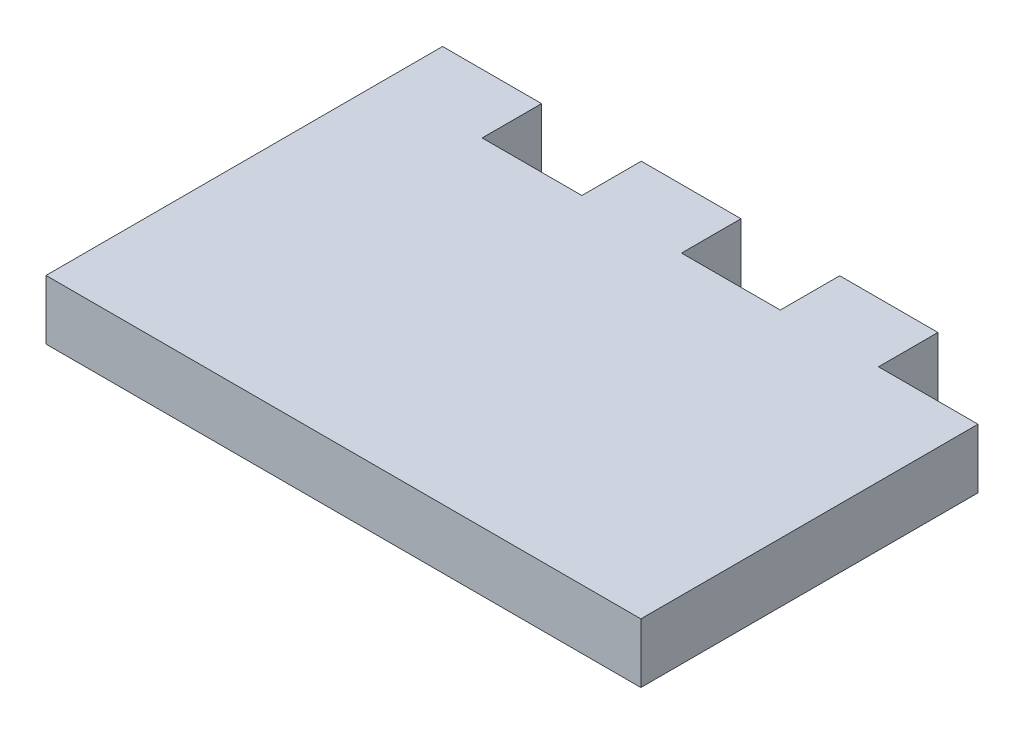
ISO-10303-21;
HEADER;
FILE_DESCRIPTION(('STEP AP214'),'2;1');
FILE_NAME('part.step','',(''),(''),'','','');
FILE_SCHEMA(('AUTOMOTIVE_DESIGN { 1 0 10303 214 1 1 1 1 }'));
ENDSEC;
DATA;
#1=APPLICATION_CONTEXT('core data for automotive mechanical design processes');
#2=APPLICATION_PROTOCOL_DEFINITION('international standard','automotive_design',2000,#1);
#3=PRODUCT_CONTEXT('',#1,'mechanical');
#4=PRODUCT('Part','Part','',(#3));
#5=PRODUCT_RELATED_PRODUCT_CATEGORY('part','',(#4));
#6=PRODUCT_DEFINITION_FORMATION('','',#4);
#7=PRODUCT_DEFINITION_CONTEXT('part definition',#1,'design');
#8=PRODUCT_DEFINITION('design','',#6,#7);
#9=PRODUCT_DEFINITION_SHAPE('','',#8);
#10=(LENGTH_UNIT() NAMED_UNIT(*) SI_UNIT(.MILLI.,.METRE.));
#11=(NAMED_UNIT(*) PLANE_ANGLE_UNIT() SI_UNIT($,.RADIAN.));
#12=(NAMED_UNIT(*) SI_UNIT($,.STERADIAN.) SOLID_ANGLE_UNIT());
#13=UNCERTAINTY_MEASURE_WITH_UNIT(LENGTH_MEASURE(1.E-05),#10,'distance_accuracy_value','');
#14=(GEOMETRIC_REPRESENTATION_CONTEXT(3) GLOBAL_UNCERTAINTY_ASSIGNED_CONTEXT((#13)) GLOBAL_UNIT_ASSIGNED_CONTEXT((#10,
#11,#12)) REPRESENTATION_CONTEXT('',''));
#15=CARTESIAN_POINT('',(0.,0.,0.));
#16=DIRECTION('',(0.,0.,1.));
#17=DIRECTION('',(1.,0.,0.));
#18=AXIS2_PLACEMENT_3D('',#15,#16,#17);
#19=CARTESIAN_POINT('',(0.,3.,-20.));
#20=DIRECTION('',(0.,0.,-1.));
#21=DIRECTION('',(-1.,0.,0.));
#22=AXIS2_PLACEMENT_3D('',#19,#20,#21);
#23=PLANE('',#22);
#24=DIRECTION('',(1.,0.,0.));
#25=VECTOR('',#24,1.);
#26=CARTESIAN_POINT('',(0.,0.,-20.));
#27=LINE('',#26,#25);
#28=CARTESIAN_POINT('',(10.021053013692,0.,-20.));
#29=VERTEX_POINT('',#28);
#30=CARTESIAN_POINT('',(15.0490536648897,0.,-20.));
#31=VERTEX_POINT('',#30);
#32=EDGE_CURVE('E198',#29,#31,#27,.T.);
#33=ORIENTED_EDGE('',*,*,#32,.F.);
#34=DIRECTION('',(0.,1.,0.));
#35=VECTOR('',#34,1.);
#36=CARTESIAN_POINT('',(10.021053013692,0.,-20.));
#37=LINE('',#36,#35);
#38=CARTESIAN_POINT('',(10.021053013692,3.,-20.));
#39=VERTEX_POINT('',#38);
#40=EDGE_CURVE('E190',#29,#39,#37,.T.);
#41=ORIENTED_EDGE('',*,*,#40,.T.);
#42=DIRECTION('',(1.,0.,0.));
#43=VECTOR('',#42,1.);
#44=CARTESIAN_POINT('',(0.,3.,-20.));
#45=LINE('',#44,#43);
#46=CARTESIAN_POINT('',(15.0490536648897,3.,-20.));
#47=VERTEX_POINT('',#46);
#48=EDGE_CURVE('E287',#39,#47,#45,.T.);
#49=ORIENTED_EDGE('',*,*,#48,.T.);
#50=DIRECTION('',(0.,1.,0.));
#51=VECTOR('',#50,1.);
#52=CARTESIAN_POINT('',(15.0490536648897,0.,-20.));
#53=LINE('',#52,#51);
#54=EDGE_CURVE('E232',#31,#47,#53,.T.);
#55=ORIENTED_EDGE('',*,*,#54,.F.);
#56=EDGE_LOOP('',(#33,#41,#49,#55));
#57=FACE_BOUND('',#56,.T.);
#58=ADVANCED_FACE('F63',(#57),#23,.T.);
#59=CARTESIAN_POINT('',(20.0280006511977,0.,-20.));
#60=VERTEX_POINT('',#59);
#61=CARTESIAN_POINT('',(24.9824208050608,0.,-20.));
#62=VERTEX_POINT('',#61);
#63=EDGE_CURVE('E200',#60,#62,#27,.T.);
#64=ORIENTED_EDGE('',*,*,#63,.F.);
#65=DIRECTION('',(0.,1.,0.));
#66=VECTOR('',#65,1.);
#67=CARTESIAN_POINT('',(20.0280006511977,0.,-20.));
#68=LINE('',#67,#66);
#69=CARTESIAN_POINT('',(20.0280006511977,3.,-20.));
#70=VERTEX_POINT('',#69);
#71=EDGE_CURVE('E228',#60,#70,#68,.T.);
#72=ORIENTED_EDGE('',*,*,#71,.T.);
#73=CARTESIAN_POINT('',(24.9824208050608,3.,-20.));
#74=VERTEX_POINT('',#73);
#75=EDGE_CURVE('E288',#70,#74,#45,.T.);
#76=ORIENTED_EDGE('',*,*,#75,.T.);
#77=DIRECTION('',(0.,1.,0.));
#78=VECTOR('',#77,1.);
#79=CARTESIAN_POINT('',(24.9824208050608,0.,-20.));
#80=LINE('',#79,#78);
#81=EDGE_CURVE('E270',#62,#74,#80,.T.);
#82=ORIENTED_EDGE('',*,*,#81,.F.);
#83=EDGE_LOOP('',(#64,#72,#76,#82));
#84=FACE_BOUND('',#83,.T.);
#85=ADVANCED_FACE('F347',(#84),#23,.T.);
#86=CARTESIAN_POINT('',(0.,3.,0.));
#87=DIRECTION('',(0.,1.,0.));
#88=DIRECTION('',(0.,0.,1.));
#89=AXIS2_PLACEMENT_3D('',#86,#87,#88);
#90=PLANE('',#89);
#91=DIRECTION('',(0.,0.,1.));
#92=VECTOR('',#91,1.);
#93=CARTESIAN_POINT('',(4.99305236249431,3.,0.));
#94=LINE('',#93,#92);
#95=CARTESIAN_POINT('',(4.99305236249431,3.,-20.));
#96=VERTEX_POINT('',#95);
#97=CARTESIAN_POINT('',(4.99305236249431,3.,-17.0024106630095));
#98=VERTEX_POINT('',#97);
#99=EDGE_CURVE('E317',#96,#98,#94,.T.);
#100=ORIENTED_EDGE('',*,*,#99,.F.);
#101=CARTESIAN_POINT('',(0.,3.,-20.));
#102=VERTEX_POINT('',#101);
#103=EDGE_CURVE('E188',#102,#96,#45,.T.);
#104=ORIENTED_EDGE('',*,*,#103,.F.);
#105=DIRECTION('',(0.,0.,-1.));
#106=VECTOR('',#105,1.);
#107=CARTESIAN_POINT('',(0.,3.,0.));
#108=LINE('',#107,#106);
#109=CARTESIAN_POINT('',(0.,3.,0.));
#110=VERTEX_POINT('',#109);
#111=EDGE_CURVE('E294',#110,#102,#108,.T.);
#112=ORIENTED_EDGE('',*,*,#111,.F.);
#113=DIRECTION('',(1.,0.,0.));
#114=VECTOR('',#113,1.);
#115=CARTESIAN_POINT('',(0.,3.,0.));
#116=LINE('',#115,#114);
#117=CARTESIAN_POINT('',(30.,3.,0.));
#118=VERTEX_POINT('',#117);
#119=EDGE_CURVE('E292',#110,#118,#116,.T.);
#120=ORIENTED_EDGE('',*,*,#119,.T.);
#121=DIRECTION('',(0.,0.,-1.));
#122=VECTOR('',#121,1.);
#123=CARTESIAN_POINT('',(30.,3.,0.));
#124=LINE('',#123,#122);
#125=CARTESIAN_POINT('',(30.,3.,-17.0024106630095));
#126=VERTEX_POINT('',#125);
#127=EDGE_CURVE('E286',#118,#126,#124,.T.);
#128=ORIENTED_EDGE('',*,*,#127,.T.);
#129=DIRECTION('',(1.,0.,0.));
#130=VECTOR('',#129,1.);
#131=CARTESIAN_POINT('',(0.,3.,-17.0024106630095));
#132=LINE('',#131,#130);
#133=CARTESIAN_POINT('',(24.9824208050608,3.,-17.0024106630095));
#134=VERTEX_POINT('',#133);
#135=EDGE_CURVE('E273',#134,#126,#132,.T.);
#136=ORIENTED_EDGE('',*,*,#135,.F.);
#137=DIRECTION('',(0.,0.,1.));
#138=VECTOR('',#137,1.);
#139=CARTESIAN_POINT('',(24.9824208050608,3.,0.));
#140=LINE('',#139,#138);
#141=EDGE_CURVE('E241',#74,#134,#140,.T.);
#142=ORIENTED_EDGE('',*,*,#141,.F.);
#143=ORIENTED_EDGE('',*,*,#75,.F.);
#144=DIRECTION('',(0.,0.,1.));
#145=VECTOR('',#144,1.);
#146=CARTESIAN_POINT('',(20.0280006511977,3.,0.));
#147=LINE('',#146,#145);
#148=CARTESIAN_POINT('',(20.0280006511977,3.,-17.0024106630095));
#149=VERTEX_POINT('',#148);
#150=EDGE_CURVE('E251',#70,#149,#147,.T.);
#151=ORIENTED_EDGE('',*,*,#150,.T.);
#152=DIRECTION('',(1.,0.,0.));
#153=VECTOR('',#152,1.);
#154=CARTESIAN_POINT('',(0.,3.,-17.0024106630095));
#155=LINE('',#154,#153);
#156=CARTESIAN_POINT('',(15.0490536648897,3.,-17.0024106630095));
#157=VERTEX_POINT('',#156);
#158=EDGE_CURVE('E242',#157,#149,#155,.T.);
#159=ORIENTED_EDGE('',*,*,#158,.F.);
#160=DIRECTION('',(0.,0.,1.));
#161=VECTOR('',#160,1.);
#162=CARTESIAN_POINT('',(15.0490536648897,3.,0.));
#163=LINE('',#162,#161);
#164=EDGE_CURVE('E246',#47,#157,#163,.T.);
#165=ORIENTED_EDGE('',*,*,#164,.F.);
#166=ORIENTED_EDGE('',*,*,#48,.F.);
#167=DIRECTION('',(0.,0.,1.));
#168=VECTOR('',#167,1.);
#169=CARTESIAN_POINT('',(10.021053013692,3.,0.));
#170=LINE('',#169,#168);
#171=CARTESIAN_POINT('',(10.021053013692,3.,-17.0024106630095));
#172=VERTEX_POINT('',#171);
#173=EDGE_CURVE('E255',#39,#172,#170,.T.);
#174=ORIENTED_EDGE('',*,*,#173,.T.);
#175=DIRECTION('',(1.,0.,0.));
#176=VECTOR('',#175,1.);
#177=CARTESIAN_POINT('',(0.,3.,-17.0024106630095));
#178=LINE('',#177,#176);
#179=EDGE_CURVE('E222',#98,#172,#178,.T.);
#180=ORIENTED_EDGE('',*,*,#179,.F.);
#181=EDGE_LOOP('',(#100,#104,#112,#120,#128,#136,#142,#143,#151,#159,#165,#166,#174,#180));
#182=FACE_BOUND('',#181,.T.);
#183=ADVANCED_FACE('F315',(#182),#90,.T.);
#184=CARTESIAN_POINT('',(0.,0.,0.));
#185=DIRECTION('',(0.,1.,0.));
#186=DIRECTION('',(0.,0.,1.));
#187=AXIS2_PLACEMENT_3D('',#184,#185,#186);
#188=PLANE('',#187);
#189=CARTESIAN_POINT('',(0.,0.,-20.));
#190=VERTEX_POINT('',#189);
#191=CARTESIAN_POINT('',(4.99305236249431,0.,-20.));
#192=VERTEX_POINT('',#191);
#193=EDGE_CURVE('E185',#190,#192,#27,.T.);
#194=ORIENTED_EDGE('',*,*,#193,.T.);
#195=DIRECTION('',(0.,0.,1.));
#196=VECTOR('',#195,1.);
#197=CARTESIAN_POINT('',(4.99305236249431,0.,0.));
#198=LINE('',#197,#196);
#199=CARTESIAN_POINT('',(4.99305236249431,0.,-17.0024106630095));
#200=VERTEX_POINT('',#199);
#201=EDGE_CURVE('E167',#192,#200,#198,.T.);
#202=ORIENTED_EDGE('',*,*,#201,.T.);
#203=DIRECTION('',(1.,0.,0.));
#204=VECTOR('',#203,1.);
#205=CARTESIAN_POINT('',(0.,0.,-17.0024106630095));
#206=LINE('',#205,#204);
#207=CARTESIAN_POINT('',(10.021053013692,0.,-17.0024106630095));
#208=VERTEX_POINT('',#207);
#209=EDGE_CURVE('E179',#200,#208,#206,.T.);
#210=ORIENTED_EDGE('',*,*,#209,.T.);
#211=DIRECTION('',(0.,0.,1.));
#212=VECTOR('',#211,1.);
#213=CARTESIAN_POINT('',(10.021053013692,0.,0.));
#214=LINE('',#213,#212);
#215=EDGE_CURVE('E180',#29,#208,#214,.T.);
#216=ORIENTED_EDGE('',*,*,#215,.F.);
#217=ORIENTED_EDGE('',*,*,#32,.T.);
#218=DIRECTION('',(0.,0.,1.));
#219=VECTOR('',#218,1.);
#220=CARTESIAN_POINT('',(15.0490536648897,0.,0.));
#221=LINE('',#220,#219);
#222=CARTESIAN_POINT('',(15.0490536648897,0.,-17.0024106630095));
#223=VERTEX_POINT('',#222);
#224=EDGE_CURVE('E258',#31,#223,#221,.T.);
#225=ORIENTED_EDGE('',*,*,#224,.T.);
#226=DIRECTION('',(1.,0.,0.));
#227=VECTOR('',#226,1.);
#228=CARTESIAN_POINT('',(0.,0.,-17.0024106630095));
#229=LINE('',#228,#227);
#230=CARTESIAN_POINT('',(20.0280006511977,0.,-17.0024106630095));
#231=VERTEX_POINT('',#230);
#232=EDGE_CURVE('E81',#223,#231,#229,.T.);
#233=ORIENTED_EDGE('',*,*,#232,.T.);
#234=DIRECTION('',(0.,0.,1.));
#235=VECTOR('',#234,1.);
#236=CARTESIAN_POINT('',(20.0280006511977,0.,0.));
#237=LINE('',#236,#235);
#238=EDGE_CURVE('E247',#60,#231,#237,.T.);
#239=ORIENTED_EDGE('',*,*,#238,.F.);
#240=ORIENTED_EDGE('',*,*,#63,.T.);
#241=DIRECTION('',(0.,0.,1.));
#242=VECTOR('',#241,1.);
#243=CARTESIAN_POINT('',(24.9824208050608,0.,0.));
#244=LINE('',#243,#242);
#245=CARTESIAN_POINT('',(24.9824208050608,0.,-17.0024106630095));
#246=VERTEX_POINT('',#245);
#247=EDGE_CURVE('E276',#62,#246,#244,.T.);
#248=ORIENTED_EDGE('',*,*,#247,.T.);
#249=DIRECTION('',(1.,0.,0.));
#250=VECTOR('',#249,1.);
#251=CARTESIAN_POINT('',(0.,0.,-17.0024106630095));
#252=LINE('',#251,#250);
#253=CARTESIAN_POINT('',(30.,0.,-17.0024106630095));
#254=VERTEX_POINT('',#253);
#255=EDGE_CURVE('E267',#246,#254,#252,.T.);
#256=ORIENTED_EDGE('',*,*,#255,.T.);
#257=DIRECTION('',(0.,0.,-1.));
#258=VECTOR('',#257,1.);
#259=CARTESIAN_POINT('',(30.,0.,0.));
#260=LINE('',#259,#258);
#261=CARTESIAN_POINT('',(30.,0.,0.));
#262=VERTEX_POINT('',#261);
#263=EDGE_CURVE('E197',#262,#254,#260,.T.);
#264=ORIENTED_EDGE('',*,*,#263,.F.);
#265=DIRECTION('',(1.,0.,0.));
#266=VECTOR('',#265,1.);
#267=CARTESIAN_POINT('',(0.,0.,0.));
#268=LINE('',#267,#266);
#269=CARTESIAN_POINT('',(0.,0.,0.));
#270=VERTEX_POINT('',#269);
#271=EDGE_CURVE('E204',#270,#262,#268,.T.);
#272=ORIENTED_EDGE('',*,*,#271,.F.);
#273=DIRECTION('',(0.,0.,-1.));
#274=VECTOR('',#273,1.);
#275=CARTESIAN_POINT('',(0.,0.,0.));
#276=LINE('',#275,#274);
#277=EDGE_CURVE('E195',#270,#190,#276,.T.);
#278=ORIENTED_EDGE('',*,*,#277,.T.);
#279=EDGE_LOOP('',(#194,#202,#210,#216,#217,#225,#233,#239,#240,#248,#256,#264,#272,#278));
#280=FACE_BOUND('',#279,.T.);
#281=ADVANCED_FACE('F192',(#280),#188,.F.);
#282=DIRECTION('',(0.,1.,0.));
#283=VECTOR('',#282,1.);
#284=CARTESIAN_POINT('',(4.99305236249431,0.,-20.));
#285=LINE('',#284,#283);
#286=EDGE_CURVE('E171',#192,#96,#285,.T.);
#287=ORIENTED_EDGE('',*,*,#286,.F.);
#288=ORIENTED_EDGE('',*,*,#193,.F.);
#289=DIRECTION('',(0.,-1.,0.));
#290=VECTOR('',#289,1.);
#291=CARTESIAN_POINT('',(0.,3.,-20.));
#292=LINE('',#291,#290);
#293=EDGE_CURVE('E12',#102,#190,#292,.T.);
#294=ORIENTED_EDGE('',*,*,#293,.F.);
#295=ORIENTED_EDGE('',*,*,#103,.T.);
#296=EDGE_LOOP('',(#287,#288,#294,#295));
#297=FACE_BOUND('',#296,.T.);
#298=ADVANCED_FACE('F65',(#297),#23,.T.);
#299=CARTESIAN_POINT('',(0.,3.,0.));
#300=DIRECTION('',(-1.,0.,0.));
#301=DIRECTION('',(0.,0.,1.));
#302=AXIS2_PLACEMENT_3D('',#299,#300,#301);
#303=PLANE('',#302);
#304=ORIENTED_EDGE('',*,*,#277,.F.);
#305=DIRECTION('',(0.,-1.,0.));
#306=VECTOR('',#305,1.);
#307=CARTESIAN_POINT('',(0.,3.,0.));
#308=LINE('',#307,#306);
#309=EDGE_CURVE('E73',#110,#270,#308,.T.);
#310=ORIENTED_EDGE('',*,*,#309,.F.);
#311=ORIENTED_EDGE('',*,*,#111,.T.);
#312=ORIENTED_EDGE('',*,*,#293,.T.);
#313=EDGE_LOOP('',(#304,#310,#311,#312));
#314=FACE_BOUND('',#313,.T.);
#315=ADVANCED_FACE('F313',(#314),#303,.T.);
#316=CARTESIAN_POINT('',(0.,3.,0.));
#317=DIRECTION('',(0.,0.,-1.));
#318=DIRECTION('',(-1.,0.,0.));
#319=AXIS2_PLACEMENT_3D('',#316,#317,#318);
#320=PLANE('',#319);
#321=ORIENTED_EDGE('',*,*,#271,.T.);
#322=DIRECTION('',(0.,-1.,0.));
#323=VECTOR('',#322,1.);
#324=CARTESIAN_POINT('',(30.,3.,0.));
#325=LINE('',#324,#323);
#326=EDGE_CURVE('E67',#118,#262,#325,.T.);
#327=ORIENTED_EDGE('',*,*,#326,.F.);
#328=ORIENTED_EDGE('',*,*,#119,.F.);
#329=ORIENTED_EDGE('',*,*,#309,.T.);
#330=EDGE_LOOP('',(#321,#327,#328,#329));
#331=FACE_BOUND('',#330,.T.);
#332=ADVANCED_FACE('F312',(#331),#320,.F.);
#333=CARTESIAN_POINT('',(30.,3.,0.));
#334=DIRECTION('',(-1.,0.,0.));
#335=DIRECTION('',(0.,0.,1.));
#336=AXIS2_PLACEMENT_3D('',#333,#334,#335);
#337=PLANE('',#336);
#338=ORIENTED_EDGE('',*,*,#263,.T.);
#339=DIRECTION('',(0.,1.,0.));
#340=VECTOR('',#339,1.);
#341=CARTESIAN_POINT('',(30.,0.,-17.0024106630095));
#342=LINE('',#341,#340);
#343=EDGE_CURVE('E89',#254,#126,#342,.T.);
#344=ORIENTED_EDGE('',*,*,#343,.T.);
#345=ORIENTED_EDGE('',*,*,#127,.F.);
#346=ORIENTED_EDGE('',*,*,#326,.T.);
#347=EDGE_LOOP('',(#338,#344,#345,#346));
#348=FACE_BOUND('',#347,.T.);
#349=ADVANCED_FACE('F353',(#348),#337,.F.);
#350=CARTESIAN_POINT('',(24.9824208050608,0.,0.));
#351=DIRECTION('',(-1.,0.,0.));
#352=DIRECTION('',(0.,0.,1.));
#353=AXIS2_PLACEMENT_3D('',#350,#351,#352);
#354=PLANE('',#353);
#355=ORIENTED_EDGE('',*,*,#141,.T.);
#356=DIRECTION('',(0.,1.,0.));
#357=VECTOR('',#356,1.);
#358=CARTESIAN_POINT('',(24.9824208050608,0.,-17.0024106630095));
#359=LINE('',#358,#357);
#360=EDGE_CURVE('E264',#246,#134,#359,.T.);
#361=ORIENTED_EDGE('',*,*,#360,.F.);
#362=ORIENTED_EDGE('',*,*,#247,.F.);
#363=ORIENTED_EDGE('',*,*,#81,.T.);
#364=EDGE_LOOP('',(#355,#361,#362,#363));
#365=FACE_BOUND('',#364,.T.);
#366=ADVANCED_FACE('F350',(#365),#354,.F.);
#367=CARTESIAN_POINT('',(0.,0.,-17.0024106630095));
#368=DIRECTION('',(0.,0.,1.));
#369=DIRECTION('',(1.,0.,0.));
#370=AXIS2_PLACEMENT_3D('',#367,#368,#369);
#371=PLANE('',#370);
#372=ORIENTED_EDGE('',*,*,#135,.T.);
#373=ORIENTED_EDGE('',*,*,#343,.F.);
#374=ORIENTED_EDGE('',*,*,#255,.F.);
#375=ORIENTED_EDGE('',*,*,#360,.T.);
#376=EDGE_LOOP('',(#372,#373,#374,#375));
#377=FACE_BOUND('',#376,.T.);
#378=ADVANCED_FACE('F352',(#377),#371,.F.);
#379=CARTESIAN_POINT('',(20.0280006511977,0.,0.));
#380=DIRECTION('',(-1.,0.,0.));
#381=DIRECTION('',(0.,0.,1.));
#382=AXIS2_PLACEMENT_3D('',#379,#380,#381);
#383=PLANE('',#382);
#384=ORIENTED_EDGE('',*,*,#150,.F.);
#385=ORIENTED_EDGE('',*,*,#71,.F.);
#386=ORIENTED_EDGE('',*,*,#238,.T.);
#387=DIRECTION('',(0.,1.,0.));
#388=VECTOR('',#387,1.);
#389=CARTESIAN_POINT('',(20.0280006511977,0.,-17.0024106630095));
#390=LINE('',#389,#388);
#391=EDGE_CURVE('E238',#231,#149,#390,.T.);
#392=ORIENTED_EDGE('',*,*,#391,.T.);
#393=EDGE_LOOP('',(#384,#385,#386,#392));
#394=FACE_BOUND('',#393,.T.);
#395=ADVANCED_FACE('F345',(#394),#383,.T.);
#396=CARTESIAN_POINT('',(0.,0.,-17.0024106630095));
#397=DIRECTION('',(0.,0.,1.));
#398=DIRECTION('',(1.,0.,0.));
#399=AXIS2_PLACEMENT_3D('',#396,#397,#398);
#400=PLANE('',#399);
#401=ORIENTED_EDGE('',*,*,#158,.T.);
#402=ORIENTED_EDGE('',*,*,#391,.F.);
#403=ORIENTED_EDGE('',*,*,#232,.F.);
#404=DIRECTION('',(0.,1.,0.));
#405=VECTOR('',#404,1.);
#406=CARTESIAN_POINT('',(15.0490536648897,0.,-17.0024106630095));
#407=LINE('',#406,#405);
#408=EDGE_CURVE('E235',#223,#157,#407,.T.);
#409=ORIENTED_EDGE('',*,*,#408,.T.);
#410=EDGE_LOOP('',(#401,#402,#403,#409));
#411=FACE_BOUND('',#410,.T.);
#412=ADVANCED_FACE('F340',(#411),#400,.F.);
#413=CARTESIAN_POINT('',(15.0490536648897,0.,0.));
#414=DIRECTION('',(-1.,0.,0.));
#415=DIRECTION('',(0.,0.,1.));
#416=AXIS2_PLACEMENT_3D('',#413,#414,#415);
#417=PLANE('',#416);
#418=ORIENTED_EDGE('',*,*,#164,.T.);
#419=ORIENTED_EDGE('',*,*,#408,.F.);
#420=ORIENTED_EDGE('',*,*,#224,.F.);
#421=ORIENTED_EDGE('',*,*,#54,.T.);
#422=EDGE_LOOP('',(#418,#419,#420,#421));
#423=FACE_BOUND('',#422,.T.);
#424=ADVANCED_FACE('F338',(#423),#417,.F.);
#425=CARTESIAN_POINT('',(0.,0.,-17.0024106630095));
#426=DIRECTION('',(0.,0.,1.));
#427=DIRECTION('',(1.,0.,0.));
#428=AXIS2_PLACEMENT_3D('',#425,#426,#427);
#429=PLANE('',#428);
#430=ORIENTED_EDGE('',*,*,#179,.T.);
#431=DIRECTION('',(0.,1.,0.));
#432=VECTOR('',#431,1.);
#433=CARTESIAN_POINT('',(10.021053013692,0.,-17.0024106630095));
#434=LINE('',#433,#432);
#435=EDGE_CURVE('E210',#208,#172,#434,.T.);
#436=ORIENTED_EDGE('',*,*,#435,.F.);
#437=ORIENTED_EDGE('',*,*,#209,.F.);
#438=DIRECTION('',(0.,1.,0.));
#439=VECTOR('',#438,1.);
#440=CARTESIAN_POINT('',(4.99305236249431,0.,-17.0024106630095));
#441=LINE('',#440,#439);
#442=EDGE_CURVE('E173',#200,#98,#441,.T.);
#443=ORIENTED_EDGE('',*,*,#442,.T.);
#444=EDGE_LOOP('',(#430,#436,#437,#443));
#445=FACE_BOUND('',#444,.T.);
#446=ADVANCED_FACE('F331',(#445),#429,.F.);
#447=CARTESIAN_POINT('',(4.99305236249431,0.,0.));
#448=DIRECTION('',(-1.,0.,0.));
#449=DIRECTION('',(0.,0.,1.));
#450=AXIS2_PLACEMENT_3D('',#447,#448,#449);
#451=PLANE('',#450);
#452=ORIENTED_EDGE('',*,*,#99,.T.);
#453=ORIENTED_EDGE('',*,*,#442,.F.);
#454=ORIENTED_EDGE('',*,*,#201,.F.);
#455=ORIENTED_EDGE('',*,*,#286,.T.);
#456=EDGE_LOOP('',(#452,#453,#454,#455));
#457=FACE_BOUND('',#456,.T.);
#458=ADVANCED_FACE('F170',(#457),#451,.F.);
#459=CARTESIAN_POINT('',(10.021053013692,0.,0.));
#460=DIRECTION('',(-1.,0.,0.));
#461=DIRECTION('',(0.,0.,1.));
#462=AXIS2_PLACEMENT_3D('',#459,#460,#461);
#463=PLANE('',#462);
#464=ORIENTED_EDGE('',*,*,#173,.F.);
#465=ORIENTED_EDGE('',*,*,#40,.F.);
#466=ORIENTED_EDGE('',*,*,#215,.T.);
#467=ORIENTED_EDGE('',*,*,#435,.T.);
#468=EDGE_LOOP('',(#464,#465,#466,#467));
#469=FACE_BOUND('',#468,.T.);
#470=ADVANCED_FACE('F328',(#469),#463,.T.);
#471=CLOSED_SHELL('',(#58,#85,#183,#281,#298,#315,#332,#349,#366,#378,#395,#412,#424,#446,#458,#470));
#472=MANIFOLD_SOLID_BREP('B2',#471);
#473=ADVANCED_BREP_SHAPE_REPRESENTATION('',(#18,#472),#14);
#474=SHAPE_DEFINITION_REPRESENTATION(#9,#473);
ENDSEC;
END-ISO-10303-21;
